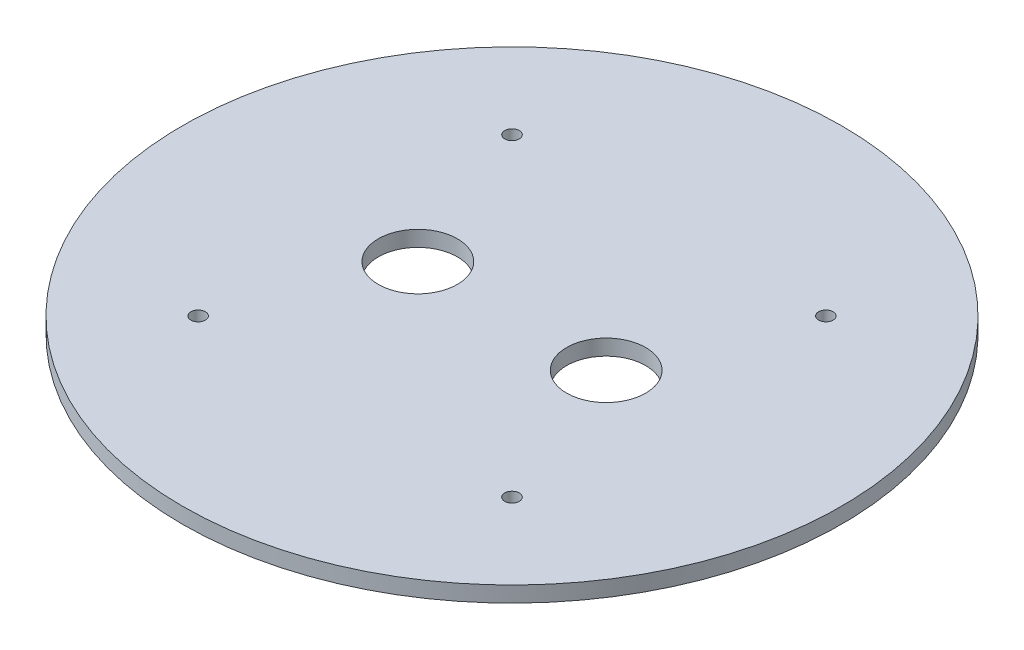
ISO-10303-21;
HEADER;
FILE_DESCRIPTION(('STEP AP214'),'2;1');
FILE_NAME('part.step','',(''),(''),'','','');
FILE_SCHEMA(('AUTOMOTIVE_DESIGN { 1 0 10303 214 1 1 1 1 }'));
ENDSEC;
DATA;
#1=APPLICATION_CONTEXT('core data for automotive mechanical design processes');
#2=APPLICATION_PROTOCOL_DEFINITION('international standard','automotive_design',2000,#1);
#3=PRODUCT_CONTEXT('',#1,'mechanical');
#4=PRODUCT('Part','Part','',(#3));
#5=PRODUCT_RELATED_PRODUCT_CATEGORY('part','',(#4));
#6=PRODUCT_DEFINITION_FORMATION('','',#4);
#7=PRODUCT_DEFINITION_CONTEXT('part definition',#1,'design');
#8=PRODUCT_DEFINITION('design','',#6,#7);
#9=PRODUCT_DEFINITION_SHAPE('','',#8);
#10=(LENGTH_UNIT() NAMED_UNIT(*) SI_UNIT(.MILLI.,.METRE.));
#11=(NAMED_UNIT(*) PLANE_ANGLE_UNIT() SI_UNIT($,.RADIAN.));
#12=(NAMED_UNIT(*) SI_UNIT($,.STERADIAN.) SOLID_ANGLE_UNIT());
#13=UNCERTAINTY_MEASURE_WITH_UNIT(LENGTH_MEASURE(1.E-05),#10,'distance_accuracy_value','');
#14=(GEOMETRIC_REPRESENTATION_CONTEXT(3) GLOBAL_UNCERTAINTY_ASSIGNED_CONTEXT((#13)) GLOBAL_UNIT_ASSIGNED_CONTEXT((#10,
#11,#12)) REPRESENTATION_CONTEXT('',''));
#15=CARTESIAN_POINT('',(0.,0.,0.));
#16=DIRECTION('',(0.,0.,1.));
#17=DIRECTION('',(1.,0.,0.));
#18=AXIS2_PLACEMENT_3D('',#15,#16,#17);
#19=CARTESIAN_POINT('',(0.,3.175,0.));
#20=DIRECTION('',(0.,-1.,0.));
#21=DIRECTION('',(0.,0.,-1.));
#22=AXIS2_PLACEMENT_3D('',#19,#20,#21);
#23=CYLINDRICAL_SURFACE('',#22,66.675);
#24=CARTESIAN_POINT('',(0.,3.175,0.));
#25=DIRECTION('',(0.,1.,0.));
#26=DIRECTION('',(0.,0.,1.));
#27=AXIS2_PLACEMENT_3D('',#24,#25,#26);
#28=CIRCLE('',#27,66.675);
#29=CARTESIAN_POINT('',(0.,3.175,66.675));
#30=VERTEX_POINT('',#29);
#31=EDGE_CURVE('E10',#30,#30,#28,.T.);
#32=ORIENTED_EDGE('',*,*,#31,.F.);
#33=EDGE_LOOP('',(#32));
#34=FACE_BOUND('',#33,.T.);
#35=CARTESIAN_POINT('',(0.,0.,0.));
#36=DIRECTION('',(0.,1.,0.));
#37=DIRECTION('',(0.,0.,1.));
#38=AXIS2_PLACEMENT_3D('',#35,#36,#37);
#39=CIRCLE('',#38,66.675);
#40=CARTESIAN_POINT('',(0.,0.,66.675));
#41=VERTEX_POINT('',#40);
#42=EDGE_CURVE('E41',#41,#41,#39,.T.);
#43=ORIENTED_EDGE('',*,*,#42,.T.);
#44=EDGE_LOOP('',(#43));
#45=FACE_BOUND('',#44,.T.);
#46=ADVANCED_FACE('F38',(#34,#45),#23,.T.);
#47=CARTESIAN_POINT('',(0.,3.175,0.));
#48=DIRECTION('',(0.,1.,0.));
#49=DIRECTION('',(0.,0.,1.));
#50=AXIS2_PLACEMENT_3D('',#47,#48,#49);
#51=PLANE('',#50);
#52=CARTESIAN_POINT('',(31.75,3.175,31.75));
#53=DIRECTION('',(0.,1.,0.));
#54=DIRECTION('',(0.,0.,1.));
#55=AXIS2_PLACEMENT_3D('',#52,#53,#54);
#56=CIRCLE('',#55,1.47319999999999);
#57=CARTESIAN_POINT('',(31.75,3.175,33.2232));
#58=VERTEX_POINT('',#57);
#59=EDGE_CURVE('E95',#58,#58,#56,.T.);
#60=ORIENTED_EDGE('',*,*,#59,.F.);
#61=EDGE_LOOP('',(#60));
#62=FACE_BOUND('',#61,.T.);
#63=CARTESIAN_POINT('',(31.75,3.175,-31.75));
#64=DIRECTION('',(0.,1.,0.));
#65=DIRECTION('',(0.,0.,1.));
#66=AXIS2_PLACEMENT_3D('',#63,#64,#65);
#67=CIRCLE('',#66,1.47319999999999);
#68=CARTESIAN_POINT('',(31.75,3.175,-30.2768));
#69=VERTEX_POINT('',#68);
#70=EDGE_CURVE('E87',#69,#69,#67,.T.);
#71=ORIENTED_EDGE('',*,*,#70,.F.);
#72=EDGE_LOOP('',(#71));
#73=FACE_BOUND('',#72,.T.);
#74=CARTESIAN_POINT('',(-31.75,3.175,31.75));
#75=DIRECTION('',(0.,1.,0.));
#76=DIRECTION('',(0.,0.,1.));
#77=AXIS2_PLACEMENT_3D('',#74,#75,#76);
#78=CIRCLE('',#77,1.47319999999999);
#79=CARTESIAN_POINT('',(-31.75,3.175,33.2232));
#80=VERTEX_POINT('',#79);
#81=EDGE_CURVE('E79',#80,#80,#78,.T.);
#82=ORIENTED_EDGE('',*,*,#81,.F.);
#83=EDGE_LOOP('',(#82));
#84=FACE_BOUND('',#83,.T.);
#85=CARTESIAN_POINT('',(-31.75,3.175,-31.75));
#86=DIRECTION('',(0.,1.,0.));
#87=DIRECTION('',(0.,0.,1.));
#88=AXIS2_PLACEMENT_3D('',#85,#86,#87);
#89=CIRCLE('',#88,1.47319999999999);
#90=CARTESIAN_POINT('',(-31.75,3.175,-30.2768));
#91=VERTEX_POINT('',#90);
#92=EDGE_CURVE('E71',#91,#91,#89,.T.);
#93=ORIENTED_EDGE('',*,*,#92,.F.);
#94=EDGE_LOOP('',(#93));
#95=FACE_BOUND('',#94,.T.);
#96=CARTESIAN_POINT('',(-19.05,3.175,0.));
#97=DIRECTION('',(0.,1.,0.));
#98=DIRECTION('',(0.,0.,1.));
#99=AXIS2_PLACEMENT_3D('',#96,#97,#98);
#100=CIRCLE('',#99,8.00100000000001);
#101=CARTESIAN_POINT('',(-19.05,3.175,8.00100000000001));
#102=VERTEX_POINT('',#101);
#103=EDGE_CURVE('E63',#102,#102,#100,.T.);
#104=ORIENTED_EDGE('',*,*,#103,.F.);
#105=EDGE_LOOP('',(#104));
#106=FACE_BOUND('',#105,.T.);
#107=CARTESIAN_POINT('',(19.05,3.175,0.));
#108=DIRECTION('',(0.,1.,0.));
#109=DIRECTION('',(0.,0.,1.));
#110=AXIS2_PLACEMENT_3D('',#107,#108,#109);
#111=CIRCLE('',#110,8.00100000000001);
#112=CARTESIAN_POINT('',(19.05,3.175,8.00100000000001));
#113=VERTEX_POINT('',#112);
#114=EDGE_CURVE('E55',#113,#113,#111,.T.);
#115=ORIENTED_EDGE('',*,*,#114,.F.);
#116=EDGE_LOOP('',(#115));
#117=FACE_BOUND('',#116,.T.);
#118=ORIENTED_EDGE('',*,*,#31,.T.);
#119=EDGE_LOOP('',(#118));
#120=FACE_BOUND('',#119,.T.);
#121=ADVANCED_FACE('F102',(#62,#73,#84,#95,#106,#117,#120),#51,.T.);
#122=CARTESIAN_POINT('',(0.,0.,0.));
#123=DIRECTION('',(0.,1.,0.));
#124=DIRECTION('',(0.,0.,1.));
#125=AXIS2_PLACEMENT_3D('',#122,#123,#124);
#126=PLANE('',#125);
#127=CARTESIAN_POINT('',(31.75,0.,31.75));
#128=DIRECTION('',(0.,1.,0.));
#129=DIRECTION('',(0.,0.,1.));
#130=AXIS2_PLACEMENT_3D('',#127,#128,#129);
#131=CIRCLE('',#130,1.4732);
#132=CARTESIAN_POINT('',(31.75,0.,33.2232));
#133=VERTEX_POINT('',#132);
#134=EDGE_CURVE('E91',#133,#133,#131,.T.);
#135=ORIENTED_EDGE('',*,*,#134,.T.);
#136=EDGE_LOOP('',(#135));
#137=FACE_BOUND('',#136,.T.);
#138=CARTESIAN_POINT('',(31.75,0.,-31.75));
#139=DIRECTION('',(0.,1.,0.));
#140=DIRECTION('',(0.,0.,1.));
#141=AXIS2_PLACEMENT_3D('',#138,#139,#140);
#142=CIRCLE('',#141,1.4732);
#143=CARTESIAN_POINT('',(31.75,0.,-30.2768));
#144=VERTEX_POINT('',#143);
#145=EDGE_CURVE('E83',#144,#144,#142,.T.);
#146=ORIENTED_EDGE('',*,*,#145,.T.);
#147=EDGE_LOOP('',(#146));
#148=FACE_BOUND('',#147,.T.);
#149=CARTESIAN_POINT('',(-31.75,0.,31.75));
#150=DIRECTION('',(0.,1.,0.));
#151=DIRECTION('',(0.,0.,1.));
#152=AXIS2_PLACEMENT_3D('',#149,#150,#151);
#153=CIRCLE('',#152,1.4732);
#154=CARTESIAN_POINT('',(-31.75,0.,33.2232));
#155=VERTEX_POINT('',#154);
#156=EDGE_CURVE('E75',#155,#155,#153,.T.);
#157=ORIENTED_EDGE('',*,*,#156,.T.);
#158=EDGE_LOOP('',(#157));
#159=FACE_BOUND('',#158,.T.);
#160=CARTESIAN_POINT('',(-31.75,0.,-31.75));
#161=DIRECTION('',(0.,1.,0.));
#162=DIRECTION('',(0.,0.,1.));
#163=AXIS2_PLACEMENT_3D('',#160,#161,#162);
#164=CIRCLE('',#163,1.4732);
#165=CARTESIAN_POINT('',(-31.75,0.,-30.2768));
#166=VERTEX_POINT('',#165);
#167=EDGE_CURVE('E67',#166,#166,#164,.T.);
#168=ORIENTED_EDGE('',*,*,#167,.T.);
#169=EDGE_LOOP('',(#168));
#170=FACE_BOUND('',#169,.T.);
#171=CARTESIAN_POINT('',(-19.05,0.,0.));
#172=DIRECTION('',(0.,1.,0.));
#173=DIRECTION('',(0.,0.,1.));
#174=AXIS2_PLACEMENT_3D('',#171,#172,#173);
#175=CIRCLE('',#174,8.00100000000001);
#176=CARTESIAN_POINT('',(-19.05,0.,8.00100000000001));
#177=VERTEX_POINT('',#176);
#178=EDGE_CURVE('E59',#177,#177,#175,.T.);
#179=ORIENTED_EDGE('',*,*,#178,.T.);
#180=EDGE_LOOP('',(#179));
#181=FACE_BOUND('',#180,.T.);
#182=CARTESIAN_POINT('',(19.05,0.,0.));
#183=DIRECTION('',(0.,1.,0.));
#184=DIRECTION('',(0.,0.,1.));
#185=AXIS2_PLACEMENT_3D('',#182,#183,#184);
#186=CIRCLE('',#185,8.00100000000001);
#187=CARTESIAN_POINT('',(19.05,0.,8.00100000000001));
#188=VERTEX_POINT('',#187);
#189=EDGE_CURVE('E50',#188,#188,#186,.T.);
#190=ORIENTED_EDGE('',*,*,#189,.T.);
#191=EDGE_LOOP('',(#190));
#192=FACE_BOUND('',#191,.T.);
#193=ORIENTED_EDGE('',*,*,#42,.F.);
#194=EDGE_LOOP('',(#193));
#195=FACE_BOUND('',#194,.T.);
#196=ADVANCED_FACE('F105',(#137,#148,#159,#170,#181,#192,#195),#126,.F.);
#197=CARTESIAN_POINT('',(19.05,3.175,0.));
#198=DIRECTION('',(0.,1.,0.));
#199=DIRECTION('',(0.,0.,1.));
#200=AXIS2_PLACEMENT_3D('',#197,#198,#199);
#201=CYLINDRICAL_SURFACE('',#200,8.00100000000001);
#202=ORIENTED_EDGE('',*,*,#189,.F.);
#203=EDGE_LOOP('',(#202));
#204=FACE_BOUND('',#203,.T.);
#205=ORIENTED_EDGE('',*,*,#114,.T.);
#206=EDGE_LOOP('',(#205));
#207=FACE_BOUND('',#206,.T.);
#208=ADVANCED_FACE('F117',(#204,#207),#201,.F.);
#209=CARTESIAN_POINT('',(-19.05,3.175,0.));
#210=DIRECTION('',(0.,1.,0.));
#211=DIRECTION('',(0.,0.,1.));
#212=AXIS2_PLACEMENT_3D('',#209,#210,#211);
#213=CYLINDRICAL_SURFACE('',#212,8.00100000000001);
#214=ORIENTED_EDGE('',*,*,#178,.F.);
#215=EDGE_LOOP('',(#214));
#216=FACE_BOUND('',#215,.T.);
#217=ORIENTED_EDGE('',*,*,#103,.T.);
#218=EDGE_LOOP('',(#217));
#219=FACE_BOUND('',#218,.T.);
#220=ADVANCED_FACE('F119',(#216,#219),#213,.F.);
#221=CARTESIAN_POINT('',(-31.75,3.175,-31.75));
#222=DIRECTION('',(0.,1.,0.));
#223=DIRECTION('',(0.,0.,1.));
#224=AXIS2_PLACEMENT_3D('',#221,#222,#223);
#225=CYLINDRICAL_SURFACE('',#224,1.47319999999999);
#226=ORIENTED_EDGE('',*,*,#167,.F.);
#227=EDGE_LOOP('',(#226));
#228=FACE_BOUND('',#227,.T.);
#229=ORIENTED_EDGE('',*,*,#92,.T.);
#230=EDGE_LOOP('',(#229));
#231=FACE_BOUND('',#230,.T.);
#232=ADVANCED_FACE('F126',(#228,#231),#225,.F.);
#233=CARTESIAN_POINT('',(-31.75,3.175,31.75));
#234=DIRECTION('',(0.,1.,0.));
#235=DIRECTION('',(0.,0.,1.));
#236=AXIS2_PLACEMENT_3D('',#233,#234,#235);
#237=CYLINDRICAL_SURFACE('',#236,1.47319999999999);
#238=ORIENTED_EDGE('',*,*,#156,.F.);
#239=EDGE_LOOP('',(#238));
#240=FACE_BOUND('',#239,.T.);
#241=ORIENTED_EDGE('',*,*,#81,.T.);
#242=EDGE_LOOP('',(#241));
#243=FACE_BOUND('',#242,.T.);
#244=ADVANCED_FACE('F156',(#240,#243),#237,.F.);
#245=CARTESIAN_POINT('',(31.75,3.175,-31.75));
#246=DIRECTION('',(0.,1.,0.));
#247=DIRECTION('',(0.,0.,1.));
#248=AXIS2_PLACEMENT_3D('',#245,#246,#247);
#249=CYLINDRICAL_SURFACE('',#248,1.47319999999999);
#250=ORIENTED_EDGE('',*,*,#145,.F.);
#251=EDGE_LOOP('',(#250));
#252=FACE_BOUND('',#251,.T.);
#253=ORIENTED_EDGE('',*,*,#70,.T.);
#254=EDGE_LOOP('',(#253));
#255=FACE_BOUND('',#254,.T.);
#256=ADVANCED_FACE('F161',(#252,#255),#249,.F.);
#257=CARTESIAN_POINT('',(31.75,3.175,31.75));
#258=DIRECTION('',(0.,1.,0.));
#259=DIRECTION('',(0.,0.,1.));
#260=AXIS2_PLACEMENT_3D('',#257,#258,#259);
#261=CYLINDRICAL_SURFACE('',#260,1.47319999999999);
#262=ORIENTED_EDGE('',*,*,#134,.F.);
#263=EDGE_LOOP('',(#262));
#264=FACE_BOUND('',#263,.T.);
#265=ORIENTED_EDGE('',*,*,#59,.T.);
#266=EDGE_LOOP('',(#265));
#267=FACE_BOUND('',#266,.T.);
#268=ADVANCED_FACE('F100',(#264,#267),#261,.F.);
#269=CLOSED_SHELL('',(#46,#121,#196,#208,#220,#232,#244,#256,#268));
#270=MANIFOLD_SOLID_BREP('B2',#269);
#271=ADVANCED_BREP_SHAPE_REPRESENTATION('',(#18,#270),#14);
#272=SHAPE_DEFINITION_REPRESENTATION(#9,#271);
ENDSEC;
END-ISO-10303-21;
